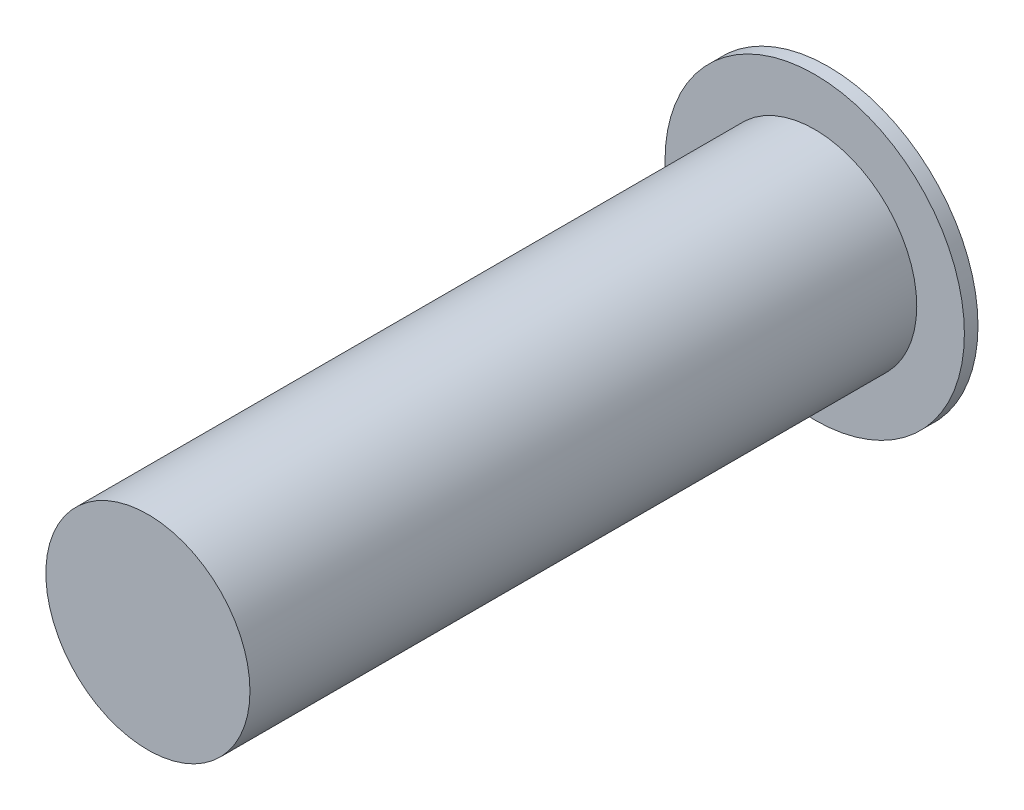
ISO-10303-21;
HEADER;
FILE_DESCRIPTION(('STEP AP214'),'2;1');
FILE_NAME('part.step','',(''),(''),'','','');
FILE_SCHEMA(('AUTOMOTIVE_DESIGN { 1 0 10303 214 1 1 1 1 }'));
ENDSEC;
DATA;
#1=APPLICATION_CONTEXT('core data for automotive mechanical design processes');
#2=APPLICATION_PROTOCOL_DEFINITION('international standard','automotive_design',2000,#1);
#3=PRODUCT_CONTEXT('',#1,'mechanical');
#4=PRODUCT('Part','Part','',(#3));
#5=PRODUCT_RELATED_PRODUCT_CATEGORY('part','',(#4));
#6=PRODUCT_DEFINITION_FORMATION('','',#4);
#7=PRODUCT_DEFINITION_CONTEXT('part definition',#1,'design');
#8=PRODUCT_DEFINITION('design','',#6,#7);
#9=PRODUCT_DEFINITION_SHAPE('','',#8);
#10=(LENGTH_UNIT() NAMED_UNIT(*) SI_UNIT(.MILLI.,.METRE.));
#11=(NAMED_UNIT(*) PLANE_ANGLE_UNIT() SI_UNIT($,.RADIAN.));
#12=(NAMED_UNIT(*) SI_UNIT($,.STERADIAN.) SOLID_ANGLE_UNIT());
#13=UNCERTAINTY_MEASURE_WITH_UNIT(LENGTH_MEASURE(1.E-05),#10,'distance_accuracy_value','');
#14=(GEOMETRIC_REPRESENTATION_CONTEXT(3) GLOBAL_UNCERTAINTY_ASSIGNED_CONTEXT((#13)) GLOBAL_UNIT_ASSIGNED_CONTEXT((#10,
#11,#12)) REPRESENTATION_CONTEXT('',''));
#15=CARTESIAN_POINT('',(0.,0.,0.));
#16=DIRECTION('',(0.,0.,1.));
#17=DIRECTION('',(1.,0.,0.));
#18=AXIS2_PLACEMENT_3D('',#15,#16,#17);
#19=CARTESIAN_POINT('',(0.,0.,2.));
#20=DIRECTION('',(0.,0.,-1.));
#21=DIRECTION('',(-1.,0.,0.));
#22=AXIS2_PLACEMENT_3D('',#19,#20,#21);
#23=CYLINDRICAL_SURFACE('',#22,22.);
#24=CARTESIAN_POINT('',(0.,0.,2.));
#25=DIRECTION('',(0.,0.,1.));
#26=DIRECTION('',(1.,0.,0.));
#27=AXIS2_PLACEMENT_3D('',#24,#25,#26);
#28=CIRCLE('',#27,22.);
#29=CARTESIAN_POINT('',(22.,0.,2.));
#30=VERTEX_POINT('',#29);
#31=EDGE_CURVE('E10',#30,#30,#28,.T.);
#32=ORIENTED_EDGE('',*,*,#31,.F.);
#33=EDGE_LOOP('',(#32));
#34=FACE_BOUND('',#33,.T.);
#35=CARTESIAN_POINT('',(0.,0.,0.));
#36=DIRECTION('',(0.,0.,1.));
#37=DIRECTION('',(1.,0.,0.));
#38=AXIS2_PLACEMENT_3D('',#35,#36,#37);
#39=CIRCLE('',#38,22.);
#40=CARTESIAN_POINT('',(22.,0.,0.));
#41=VERTEX_POINT('',#40);
#42=EDGE_CURVE('E36',#41,#41,#39,.T.);
#43=ORIENTED_EDGE('',*,*,#42,.T.);
#44=EDGE_LOOP('',(#43));
#45=FACE_BOUND('',#44,.T.);
#46=ADVANCED_FACE('F33',(#34,#45),#23,.T.);
#47=CARTESIAN_POINT('',(0.,0.,2.));
#48=DIRECTION('',(0.,0.,1.));
#49=DIRECTION('',(1.,0.,0.));
#50=AXIS2_PLACEMENT_3D('',#47,#48,#49);
#51=PLANE('',#50);
#52=CARTESIAN_POINT('',(0.,0.,2.));
#53=DIRECTION('',(0.,0.,1.));
#54=DIRECTION('',(1.,0.,0.));
#55=AXIS2_PLACEMENT_3D('',#52,#53,#54);
#56=CIRCLE('',#55,15.);
#57=CARTESIAN_POINT('',(15.,0.,2.));
#58=VERTEX_POINT('',#57);
#59=EDGE_CURVE('E43',#58,#58,#56,.F.);
#60=ORIENTED_EDGE('',*,*,#59,.T.);
#61=EDGE_LOOP('',(#60));
#62=FACE_BOUND('',#61,.T.);
#63=ORIENTED_EDGE('',*,*,#31,.T.);
#64=EDGE_LOOP('',(#63));
#65=FACE_BOUND('',#64,.T.);
#66=ADVANCED_FACE('F63',(#62,#65),#51,.T.);
#67=CARTESIAN_POINT('',(0.,0.,0.));
#68=DIRECTION('',(0.,0.,1.));
#69=DIRECTION('',(1.,0.,0.));
#70=AXIS2_PLACEMENT_3D('',#67,#68,#69);
#71=PLANE('',#70);
#72=ORIENTED_EDGE('',*,*,#42,.F.);
#73=EDGE_LOOP('',(#72));
#74=FACE_BOUND('',#73,.T.);
#75=ADVANCED_FACE('F55',(#74),#71,.F.);
#76=CARTESIAN_POINT('',(0.,0.,100.));
#77=DIRECTION('',(0.,0.,-1.));
#78=DIRECTION('',(-1.,0.,0.));
#79=AXIS2_PLACEMENT_3D('',#76,#77,#78);
#80=CYLINDRICAL_SURFACE('',#79,15.);
#81=ORIENTED_EDGE('',*,*,#59,.F.);
#82=EDGE_LOOP('',(#81));
#83=FACE_BOUND('',#82,.T.);
#84=CARTESIAN_POINT('',(0.,0.,100.));
#85=DIRECTION('',(0.,0.,1.));
#86=DIRECTION('',(1.,0.,0.));
#87=AXIS2_PLACEMENT_3D('',#84,#85,#86);
#88=CIRCLE('',#87,15.);
#89=CARTESIAN_POINT('',(15.,0.,100.));
#90=VERTEX_POINT('',#89);
#91=EDGE_CURVE('E47',#90,#90,#88,.T.);
#92=ORIENTED_EDGE('',*,*,#91,.F.);
#93=EDGE_LOOP('',(#92));
#94=FACE_BOUND('',#93,.T.);
#95=ADVANCED_FACE('F53',(#83,#94),#80,.T.);
#96=CARTESIAN_POINT('',(0.,0.,100.));
#97=DIRECTION('',(0.,0.,1.));
#98=DIRECTION('',(1.,0.,0.));
#99=AXIS2_PLACEMENT_3D('',#96,#97,#98);
#100=PLANE('',#99);
#101=ORIENTED_EDGE('',*,*,#91,.T.);
#102=EDGE_LOOP('',(#101));
#103=FACE_BOUND('',#102,.T.);
#104=ADVANCED_FACE('F51',(#103),#100,.T.);
#105=CLOSED_SHELL('',(#46,#66,#75,#95,#104));
#106=MANIFOLD_SOLID_BREP('B2',#105);
#107=ADVANCED_BREP_SHAPE_REPRESENTATION('',(#18,#106),#14);
#108=SHAPE_DEFINITION_REPRESENTATION(#9,#107);
ENDSEC;
END-ISO-10303-21;
